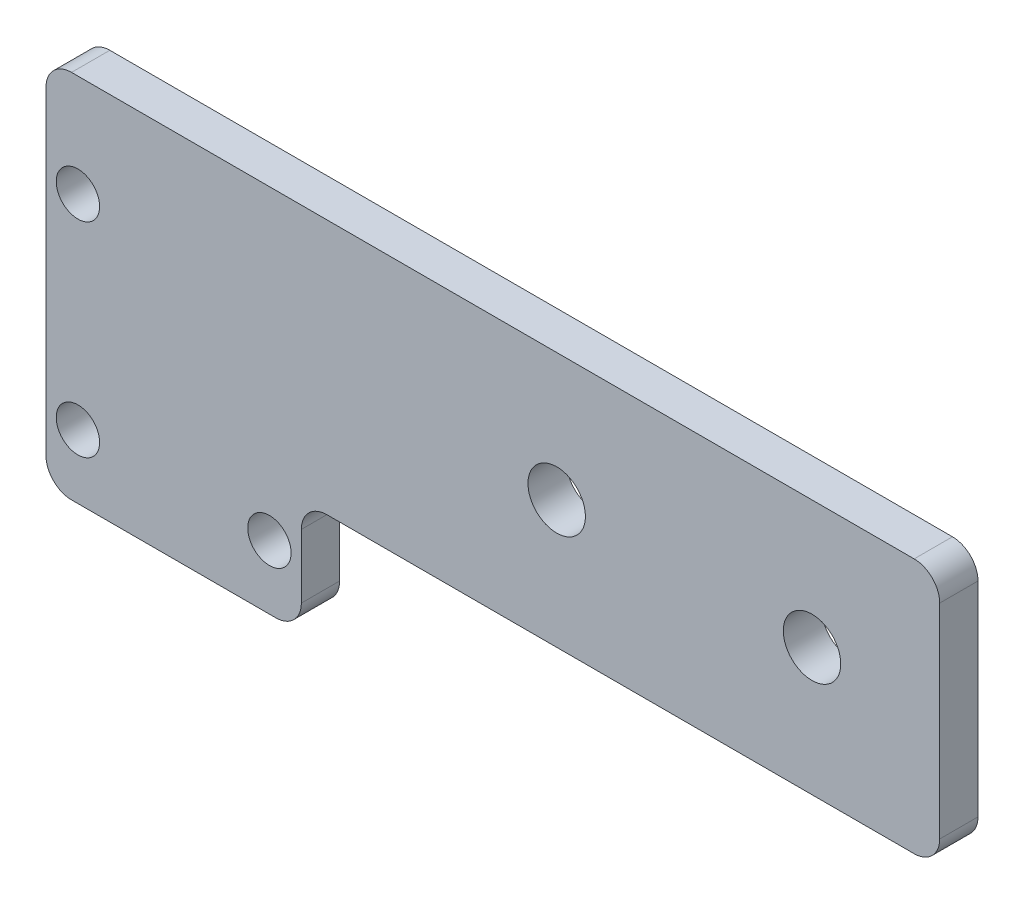
ISO-10303-21;
HEADER;
FILE_DESCRIPTION(('STEP AP214'),'2;1');
FILE_NAME('part.step','',(''),(''),'','','');
FILE_SCHEMA(('AUTOMOTIVE_DESIGN { 1 0 10303 214 1 1 1 1 }'));
ENDSEC;
DATA;
#1=APPLICATION_CONTEXT('core data for automotive mechanical design processes');
#2=APPLICATION_PROTOCOL_DEFINITION('international standard','automotive_design',2000,#1);
#3=PRODUCT_CONTEXT('',#1,'mechanical');
#4=PRODUCT('Part','Part','',(#3));
#5=PRODUCT_RELATED_PRODUCT_CATEGORY('part','',(#4));
#6=PRODUCT_DEFINITION_FORMATION('','',#4);
#7=PRODUCT_DEFINITION_CONTEXT('part definition',#1,'design');
#8=PRODUCT_DEFINITION('design','',#6,#7);
#9=PRODUCT_DEFINITION_SHAPE('','',#8);
#10=(LENGTH_UNIT() NAMED_UNIT(*) SI_UNIT(.MILLI.,.METRE.));
#11=(NAMED_UNIT(*) PLANE_ANGLE_UNIT() SI_UNIT($,.RADIAN.));
#12=(NAMED_UNIT(*) SI_UNIT($,.STERADIAN.) SOLID_ANGLE_UNIT());
#13=UNCERTAINTY_MEASURE_WITH_UNIT(LENGTH_MEASURE(1.E-05),#10,'distance_accuracy_value','');
#14=(GEOMETRIC_REPRESENTATION_CONTEXT(3) GLOBAL_UNCERTAINTY_ASSIGNED_CONTEXT((#13)) GLOBAL_UNIT_ASSIGNED_CONTEXT((#10,
#11,#12)) REPRESENTATION_CONTEXT('',''));
#15=CARTESIAN_POINT('',(0.,0.,0.));
#16=DIRECTION('',(0.,0.,1.));
#17=DIRECTION('',(1.,0.,0.));
#18=AXIS2_PLACEMENT_3D('',#15,#16,#17);
#19=CARTESIAN_POINT('',(50.,0.,3.));
#20=DIRECTION('',(0.,1.,0.));
#21=DIRECTION('',(-1.,0.,0.));
#22=AXIS2_PLACEMENT_3D('',#19,#20,#21);
#23=PLANE('',#22);
#24=DIRECTION('',(1.,0.,0.));
#25=VECTOR('',#24,1.);
#26=CARTESIAN_POINT('',(50.,0.,3.));
#27=LINE('',#26,#25);
#28=CARTESIAN_POINT('',(2.,0.,3.));
#29=VERTEX_POINT('',#28);
#30=CARTESIAN_POINT('',(48.,0.,3.));
#31=VERTEX_POINT('',#30);
#32=EDGE_CURVE('E167',#29,#31,#27,.T.);
#33=ORIENTED_EDGE('',*,*,#32,.F.);
#34=DIRECTION('',(0.,0.,-1.));
#35=VECTOR('',#34,1.);
#36=CARTESIAN_POINT('',(2.,0.,0.));
#37=LINE('',#36,#35);
#38=CARTESIAN_POINT('',(2.,0.,0.));
#39=VERTEX_POINT('',#38);
#40=EDGE_CURVE('E242',#29,#39,#37,.T.);
#41=ORIENTED_EDGE('',*,*,#40,.T.);
#42=DIRECTION('',(1.,0.,0.));
#43=VECTOR('',#42,1.);
#44=CARTESIAN_POINT('',(50.,0.,0.));
#45=LINE('',#44,#43);
#46=CARTESIAN_POINT('',(48.,0.,0.));
#47=VERTEX_POINT('',#46);
#48=EDGE_CURVE('E264',#39,#47,#45,.T.);
#49=ORIENTED_EDGE('',*,*,#48,.T.);
#50=DIRECTION('',(0.,0.,-1.));
#51=VECTOR('',#50,1.);
#52=CARTESIAN_POINT('',(48.,0.,3.));
#53=LINE('',#52,#51);
#54=EDGE_CURVE('E241',#47,#31,#53,.F.);
#55=ORIENTED_EDGE('',*,*,#54,.T.);
#56=EDGE_LOOP('',(#33,#41,#49,#55));
#57=FACE_BOUND('',#56,.T.);
#58=ADVANCED_FACE('F46',(#57),#23,.F.);
#59=CARTESIAN_POINT('',(50.,20.,3.));
#60=DIRECTION('',(-1.,0.,0.));
#61=DIRECTION('',(0.,0.,1.));
#62=AXIS2_PLACEMENT_3D('',#59,#60,#61);
#63=PLANE('',#62);
#64=DIRECTION('',(0.,1.,0.));
#65=VECTOR('',#64,1.);
#66=CARTESIAN_POINT('',(50.,20.,3.));
#67=LINE('',#66,#65);
#68=CARTESIAN_POINT('',(50.,2.,3.));
#69=VERTEX_POINT('',#68);
#70=CARTESIAN_POINT('',(50.,18.,3.));
#71=VERTEX_POINT('',#70);
#72=EDGE_CURVE('E215',#69,#71,#67,.T.);
#73=ORIENTED_EDGE('',*,*,#72,.F.);
#74=DIRECTION('',(0.,0.,-1.));
#75=VECTOR('',#74,1.);
#76=CARTESIAN_POINT('',(50.,2.,3.));
#77=LINE('',#76,#75);
#78=CARTESIAN_POINT('',(50.,2.,0.));
#79=VERTEX_POINT('',#78);
#80=EDGE_CURVE('E252',#69,#79,#77,.T.);
#81=ORIENTED_EDGE('',*,*,#80,.T.);
#82=DIRECTION('',(0.,1.,0.));
#83=VECTOR('',#82,1.);
#84=CARTESIAN_POINT('',(50.,20.,0.));
#85=LINE('',#84,#83);
#86=CARTESIAN_POINT('',(50.,18.,0.));
#87=VERTEX_POINT('',#86);
#88=EDGE_CURVE('E308',#79,#87,#85,.T.);
#89=ORIENTED_EDGE('',*,*,#88,.T.);
#90=DIRECTION('',(0.,0.,-1.));
#91=VECTOR('',#90,1.);
#92=CARTESIAN_POINT('',(50.,18.,3.));
#93=LINE('',#92,#91);
#94=EDGE_CURVE('E247',#87,#71,#93,.F.);
#95=ORIENTED_EDGE('',*,*,#94,.T.);
#96=EDGE_LOOP('',(#73,#81,#89,#95));
#97=FACE_BOUND('',#96,.T.);
#98=ADVANCED_FACE('F326',(#97),#63,.F.);
#99=CARTESIAN_POINT('',(-20.,20.,3.));
#100=DIRECTION('',(0.,-1.,0.));
#101=DIRECTION('',(0.,0.,-1.));
#102=AXIS2_PLACEMENT_3D('',#99,#100,#101);
#103=PLANE('',#102);
#104=DIRECTION('',(-1.,0.,0.));
#105=VECTOR('',#104,1.);
#106=CARTESIAN_POINT('',(-20.,20.,0.));
#107=LINE('',#106,#105);
#108=CARTESIAN_POINT('',(48.,20.,0.));
#109=VERTEX_POINT('',#108);
#110=CARTESIAN_POINT('',(-18.,20.,0.));
#111=VERTEX_POINT('',#110);
#112=EDGE_CURVE('E175',#109,#111,#107,.T.);
#113=ORIENTED_EDGE('',*,*,#112,.T.);
#114=DIRECTION('',(0.,0.,-1.));
#115=VECTOR('',#114,1.);
#116=CARTESIAN_POINT('',(-18.,20.,3.));
#117=LINE('',#116,#115);
#118=CARTESIAN_POINT('',(-18.,20.,3.));
#119=VERTEX_POINT('',#118);
#120=EDGE_CURVE('E259',#111,#119,#117,.F.);
#121=ORIENTED_EDGE('',*,*,#120,.T.);
#122=DIRECTION('',(-1.,0.,0.));
#123=VECTOR('',#122,1.);
#124=CARTESIAN_POINT('',(-20.,20.,3.));
#125=LINE('',#124,#123);
#126=CARTESIAN_POINT('',(48.,20.,3.));
#127=VERTEX_POINT('',#126);
#128=EDGE_CURVE('E207',#127,#119,#125,.T.);
#129=ORIENTED_EDGE('',*,*,#128,.F.);
#130=DIRECTION('',(0.,0.,-1.));
#131=VECTOR('',#130,1.);
#132=CARTESIAN_POINT('',(48.,20.,3.));
#133=LINE('',#132,#131);
#134=EDGE_CURVE('E253',#127,#109,#133,.T.);
#135=ORIENTED_EDGE('',*,*,#134,.T.);
#136=EDGE_LOOP('',(#113,#121,#129,#135));
#137=FACE_BOUND('',#136,.T.);
#138=ADVANCED_FACE('F304',(#137),#103,.F.);
#139=CARTESIAN_POINT('',(-20.,-9.,3.));
#140=DIRECTION('',(1.,0.,0.));
#141=DIRECTION('',(0.,0.,-1.));
#142=AXIS2_PLACEMENT_3D('',#139,#140,#141);
#143=PLANE('',#142);
#144=DIRECTION('',(0.,-1.,0.));
#145=VECTOR('',#144,1.);
#146=CARTESIAN_POINT('',(-20.,-9.,0.));
#147=LINE('',#146,#145);
#148=CARTESIAN_POINT('',(-20.,18.,0.));
#149=VERTEX_POINT('',#148);
#150=CARTESIAN_POINT('',(-20.,-7.,0.));
#151=VERTEX_POINT('',#150);
#152=EDGE_CURVE('E168',#149,#151,#147,.T.);
#153=ORIENTED_EDGE('',*,*,#152,.T.);
#154=DIRECTION('',(0.,0.,-1.));
#155=VECTOR('',#154,1.);
#156=CARTESIAN_POINT('',(-20.,-7.,3.));
#157=LINE('',#156,#155);
#158=CARTESIAN_POINT('',(-20.,-7.,3.));
#159=VERTEX_POINT('',#158);
#160=EDGE_CURVE('E142',#151,#159,#157,.F.);
#161=ORIENTED_EDGE('',*,*,#160,.T.);
#162=DIRECTION('',(0.,-1.,0.));
#163=VECTOR('',#162,1.);
#164=CARTESIAN_POINT('',(-20.,-9.,3.));
#165=LINE('',#164,#163);
#166=CARTESIAN_POINT('',(-20.,18.,3.));
#167=VERTEX_POINT('',#166);
#168=EDGE_CURVE('E213',#167,#159,#165,.T.);
#169=ORIENTED_EDGE('',*,*,#168,.F.);
#170=DIRECTION('',(0.,0.,-1.));
#171=VECTOR('',#170,1.);
#172=CARTESIAN_POINT('',(-20.,18.,3.));
#173=LINE('',#172,#171);
#174=EDGE_CURVE('E150',#167,#149,#173,.T.);
#175=ORIENTED_EDGE('',*,*,#174,.T.);
#176=EDGE_LOOP('',(#153,#161,#169,#175));
#177=FACE_BOUND('',#176,.T.);
#178=ADVANCED_FACE('F297',(#177),#143,.F.);
#179=CARTESIAN_POINT('',(0.,-9.,3.));
#180=DIRECTION('',(0.,1.,0.));
#181=DIRECTION('',(0.,0.,1.));
#182=AXIS2_PLACEMENT_3D('',#179,#180,#181);
#183=PLANE('',#182);
#184=DIRECTION('',(0.,0.,-1.));
#185=VECTOR('',#184,1.);
#186=CARTESIAN_POINT('',(-2.,-9.,3.));
#187=LINE('',#186,#185);
#188=CARTESIAN_POINT('',(-2.,-9.,0.));
#189=VERTEX_POINT('',#188);
#190=CARTESIAN_POINT('',(-2.,-9.,3.));
#191=VERTEX_POINT('',#190);
#192=EDGE_CURVE('E233',#189,#191,#187,.F.);
#193=ORIENTED_EDGE('',*,*,#192,.T.);
#194=DIRECTION('',(1.,0.,0.));
#195=VECTOR('',#194,1.);
#196=CARTESIAN_POINT('',(-15.,-9.,3.));
#197=LINE('',#196,#195);
#198=CARTESIAN_POINT('',(-18.,-9.,3.));
#199=VERTEX_POINT('',#198);
#200=EDGE_CURVE('E159',#199,#191,#197,.T.);
#201=ORIENTED_EDGE('',*,*,#200,.F.);
#202=DIRECTION('',(0.,0.,-1.));
#203=VECTOR('',#202,1.);
#204=CARTESIAN_POINT('',(-18.,-9.,3.));
#205=LINE('',#204,#203);
#206=CARTESIAN_POINT('',(-18.,-9.,0.));
#207=VERTEX_POINT('',#206);
#208=EDGE_CURVE('E137',#199,#207,#205,.T.);
#209=ORIENTED_EDGE('',*,*,#208,.T.);
#210=DIRECTION('',(1.,0.,0.));
#211=VECTOR('',#210,1.);
#212=CARTESIAN_POINT('',(-15.,-9.,0.));
#213=LINE('',#212,#211);
#214=EDGE_CURVE('E154',#207,#189,#213,.T.);
#215=ORIENTED_EDGE('',*,*,#214,.T.);
#216=EDGE_LOOP('',(#193,#201,#209,#215));
#217=FACE_BOUND('',#216,.T.);
#218=ADVANCED_FACE('F153',(#217),#183,.F.);
#219=CARTESIAN_POINT('',(0.,0.,3.));
#220=DIRECTION('',(-1.,0.,0.));
#221=DIRECTION('',(0.,-1.,0.));
#222=AXIS2_PLACEMENT_3D('',#219,#220,#221);
#223=PLANE('',#222);
#224=DIRECTION('',(0.,1.,0.));
#225=VECTOR('',#224,1.);
#226=CARTESIAN_POINT('',(0.,0.,3.));
#227=LINE('',#226,#225);
#228=CARTESIAN_POINT('',(0.,-7.,3.));
#229=VERTEX_POINT('',#228);
#230=CARTESIAN_POINT('',(0.,-2.,3.));
#231=VERTEX_POINT('',#230);
#232=EDGE_CURVE('E158',#229,#231,#227,.T.);
#233=ORIENTED_EDGE('',*,*,#232,.F.);
#234=DIRECTION('',(0.,0.,-1.));
#235=VECTOR('',#234,1.);
#236=CARTESIAN_POINT('',(0.,-7.,3.));
#237=LINE('',#236,#235);
#238=CARTESIAN_POINT('',(0.,-7.,0.));
#239=VERTEX_POINT('',#238);
#240=EDGE_CURVE('E240',#229,#239,#237,.T.);
#241=ORIENTED_EDGE('',*,*,#240,.T.);
#242=DIRECTION('',(0.,1.,0.));
#243=VECTOR('',#242,1.);
#244=CARTESIAN_POINT('',(0.,0.,0.));
#245=LINE('',#244,#243);
#246=CARTESIAN_POINT('',(0.,-2.,0.));
#247=VERTEX_POINT('',#246);
#248=EDGE_CURVE('E164',#239,#247,#245,.T.);
#249=ORIENTED_EDGE('',*,*,#248,.T.);
#250=DIRECTION('',(0.,0.,-1.));
#251=VECTOR('',#250,1.);
#252=CARTESIAN_POINT('',(0.,-2.,3.));
#253=LINE('',#252,#251);
#254=EDGE_CURVE('E65',#247,#231,#253,.F.);
#255=ORIENTED_EDGE('',*,*,#254,.T.);
#256=EDGE_LOOP('',(#233,#241,#249,#255));
#257=FACE_BOUND('',#256,.T.);
#258=ADVANCED_FACE('F266',(#257),#223,.F.);
#259=CARTESIAN_POINT('',(-10.,-21.,3.));
#260=DIRECTION('',(0.,0.,1.));
#261=DIRECTION('',(1.,0.,0.));
#262=AXIS2_PLACEMENT_3D('',#259,#260,#261);
#263=PLANE('',#262);
#264=ORIENTED_EDGE('',*,*,#200,.T.);
#265=CARTESIAN_POINT('',(-2.,-7.,3.));
#266=DIRECTION('',(0.,0.,1.));
#267=DIRECTION('',(1.,0.,0.));
#268=AXIS2_PLACEMENT_3D('',#265,#266,#267);
#269=CIRCLE('',#268,2.);
#270=EDGE_CURVE('E69',#191,#229,#269,.T.);
#271=ORIENTED_EDGE('',*,*,#270,.T.);
#272=ORIENTED_EDGE('',*,*,#232,.T.);
#273=CARTESIAN_POINT('',(2.,-2.,3.));
#274=DIRECTION('',(0.,0.,1.));
#275=DIRECTION('',(1.,0.,0.));
#276=AXIS2_PLACEMENT_3D('',#273,#274,#275);
#277=CIRCLE('',#276,2.);
#278=EDGE_CURVE('E12',#231,#29,#277,.F.);
#279=ORIENTED_EDGE('',*,*,#278,.T.);
#280=ORIENTED_EDGE('',*,*,#32,.T.);
#281=CARTESIAN_POINT('',(48.,2.,3.));
#282=DIRECTION('',(0.,0.,1.));
#283=DIRECTION('',(1.,0.,0.));
#284=AXIS2_PLACEMENT_3D('',#281,#282,#283);
#285=CIRCLE('',#284,2.);
#286=EDGE_CURVE('E286',#31,#69,#285,.T.);
#287=ORIENTED_EDGE('',*,*,#286,.T.);
#288=ORIENTED_EDGE('',*,*,#72,.T.);
#289=CARTESIAN_POINT('',(48.,18.,3.));
#290=DIRECTION('',(0.,0.,1.));
#291=DIRECTION('',(1.,0.,0.));
#292=AXIS2_PLACEMENT_3D('',#289,#290,#291);
#293=CIRCLE('',#292,2.);
#294=EDGE_CURVE('E193',#71,#127,#293,.T.);
#295=ORIENTED_EDGE('',*,*,#294,.T.);
#296=ORIENTED_EDGE('',*,*,#128,.T.);
#297=CARTESIAN_POINT('',(-18.,18.,3.));
#298=DIRECTION('',(0.,0.,1.));
#299=DIRECTION('',(1.,0.,0.));
#300=AXIS2_PLACEMENT_3D('',#297,#298,#299);
#301=CIRCLE('',#300,2.);
#302=EDGE_CURVE('E192',#119,#167,#301,.T.);
#303=ORIENTED_EDGE('',*,*,#302,.T.);
#304=ORIENTED_EDGE('',*,*,#168,.T.);
#305=CARTESIAN_POINT('',(-18.,-7.,3.));
#306=DIRECTION('',(0.,0.,1.));
#307=DIRECTION('',(1.,0.,0.));
#308=AXIS2_PLACEMENT_3D('',#305,#306,#307);
#309=CIRCLE('',#308,2.);
#310=EDGE_CURVE('E228',#159,#199,#309,.T.);
#311=ORIENTED_EDGE('',*,*,#310,.T.);
#312=EDGE_LOOP('',(#264,#271,#272,#279,#280,#287,#288,#295,#296,#303,#304,#311));
#313=FACE_BOUND('',#312,.T.);
#314=CARTESIAN_POINT('',(-17.5,12.,3.));
#315=DIRECTION('',(0.,0.,1.));
#316=DIRECTION('',(1.,0.,0.));
#317=AXIS2_PLACEMENT_3D('',#314,#315,#316);
#318=CIRCLE('',#317,1.7);
#319=CARTESIAN_POINT('',(-15.8,12.,3.));
#320=VERTEX_POINT('',#319);
#321=EDGE_CURVE('E380',#320,#320,#318,.T.);
#322=ORIENTED_EDGE('',*,*,#321,.F.);
#323=EDGE_LOOP('',(#322));
#324=FACE_BOUND('',#323,.T.);
#325=CARTESIAN_POINT('',(-2.5,-4.,3.));
#326=DIRECTION('',(0.,0.,1.));
#327=DIRECTION('',(1.,0.,0.));
#328=AXIS2_PLACEMENT_3D('',#325,#326,#327);
#329=CIRCLE('',#328,1.7);
#330=CARTESIAN_POINT('',(-0.800000000000001,-4.,3.));
#331=VERTEX_POINT('',#330);
#332=EDGE_CURVE('E379',#331,#331,#329,.T.);
#333=ORIENTED_EDGE('',*,*,#332,.F.);
#334=EDGE_LOOP('',(#333));
#335=FACE_BOUND('',#334,.T.);
#336=CARTESIAN_POINT('',(-17.5,-4.,3.));
#337=DIRECTION('',(0.,0.,1.));
#338=DIRECTION('',(1.,0.,0.));
#339=AXIS2_PLACEMENT_3D('',#336,#337,#338);
#340=CIRCLE('',#339,1.7);
#341=CARTESIAN_POINT('',(-15.8,-4.,3.));
#342=VERTEX_POINT('',#341);
#343=EDGE_CURVE('E395',#342,#342,#340,.T.);
#344=ORIENTED_EDGE('',*,*,#343,.F.);
#345=EDGE_LOOP('',(#344));
#346=FACE_BOUND('',#345,.T.);
#347=CARTESIAN_POINT('',(40.,10.,3.));
#348=DIRECTION('',(0.,0.,1.));
#349=DIRECTION('',(1.,0.,0.));
#350=AXIS2_PLACEMENT_3D('',#347,#348,#349);
#351=CIRCLE('',#350,2.25);
#352=CARTESIAN_POINT('',(42.25,10.,3.));
#353=VERTEX_POINT('',#352);
#354=EDGE_CURVE('E397',#353,#353,#351,.T.);
#355=ORIENTED_EDGE('',*,*,#354,.F.);
#356=EDGE_LOOP('',(#355));
#357=FACE_BOUND('',#356,.T.);
#358=CARTESIAN_POINT('',(20.,10.,3.));
#359=DIRECTION('',(0.,0.,1.));
#360=DIRECTION('',(1.,0.,0.));
#361=AXIS2_PLACEMENT_3D('',#358,#359,#360);
#362=CIRCLE('',#361,2.25);
#363=CARTESIAN_POINT('',(22.25,10.,3.));
#364=VERTEX_POINT('',#363);
#365=EDGE_CURVE('E406',#364,#364,#362,.T.);
#366=ORIENTED_EDGE('',*,*,#365,.F.);
#367=EDGE_LOOP('',(#366));
#368=FACE_BOUND('',#367,.T.);
#369=ADVANCED_FACE('F271',(#313,#324,#335,#346,#357,#368),#263,.T.);
#370=CARTESIAN_POINT('',(-10.,-21.,0.));
#371=DIRECTION('',(0.,0.,1.));
#372=DIRECTION('',(1.,0.,0.));
#373=AXIS2_PLACEMENT_3D('',#370,#371,#372);
#374=PLANE('',#373);
#375=CARTESIAN_POINT('',(-17.5,12.,0.));
#376=DIRECTION('',(0.,0.,1.));
#377=DIRECTION('',(1.,0.,0.));
#378=AXIS2_PLACEMENT_3D('',#375,#376,#377);
#379=CIRCLE('',#378,1.7);
#380=CARTESIAN_POINT('',(-15.8,12.,0.));
#381=VERTEX_POINT('',#380);
#382=EDGE_CURVE('E372',#381,#381,#379,.T.);
#383=ORIENTED_EDGE('',*,*,#382,.T.);
#384=EDGE_LOOP('',(#383));
#385=FACE_BOUND('',#384,.T.);
#386=CARTESIAN_POINT('',(-2.5,-4.,0.));
#387=DIRECTION('',(0.,0.,1.));
#388=DIRECTION('',(1.,0.,0.));
#389=AXIS2_PLACEMENT_3D('',#386,#387,#388);
#390=CIRCLE('',#389,1.7);
#391=CARTESIAN_POINT('',(-0.800000000000002,-4.,0.));
#392=VERTEX_POINT('',#391);
#393=EDGE_CURVE('E386',#392,#392,#390,.T.);
#394=ORIENTED_EDGE('',*,*,#393,.T.);
#395=EDGE_LOOP('',(#394));
#396=FACE_BOUND('',#395,.T.);
#397=CARTESIAN_POINT('',(-17.5,-4.,0.));
#398=DIRECTION('',(0.,0.,1.));
#399=DIRECTION('',(1.,0.,0.));
#400=AXIS2_PLACEMENT_3D('',#397,#398,#399);
#401=CIRCLE('',#400,1.7);
#402=CARTESIAN_POINT('',(-15.8,-4.,0.));
#403=VERTEX_POINT('',#402);
#404=EDGE_CURVE('E396',#403,#403,#401,.T.);
#405=ORIENTED_EDGE('',*,*,#404,.T.);
#406=EDGE_LOOP('',(#405));
#407=FACE_BOUND('',#406,.T.);
#408=CARTESIAN_POINT('',(40.,10.,0.));
#409=DIRECTION('',(0.,0.,1.));
#410=DIRECTION('',(1.,0.,0.));
#411=AXIS2_PLACEMENT_3D('',#408,#409,#410);
#412=CIRCLE('',#411,2.25);
#413=CARTESIAN_POINT('',(42.25,10.,0.));
#414=VERTEX_POINT('',#413);
#415=EDGE_CURVE('E403',#414,#414,#412,.T.);
#416=ORIENTED_EDGE('',*,*,#415,.T.);
#417=EDGE_LOOP('',(#416));
#418=FACE_BOUND('',#417,.T.);
#419=CARTESIAN_POINT('',(20.,10.,0.));
#420=DIRECTION('',(0.,0.,1.));
#421=DIRECTION('',(1.,0.,0.));
#422=AXIS2_PLACEMENT_3D('',#419,#420,#421);
#423=CIRCLE('',#422,2.25);
#424=CARTESIAN_POINT('',(22.25,10.,0.));
#425=VERTEX_POINT('',#424);
#426=EDGE_CURVE('E283',#425,#425,#423,.T.);
#427=ORIENTED_EDGE('',*,*,#426,.T.);
#428=EDGE_LOOP('',(#427));
#429=FACE_BOUND('',#428,.T.);
#430=CARTESIAN_POINT('',(-2.,-7.,0.));
#431=DIRECTION('',(0.,0.,1.));
#432=DIRECTION('',(1.,0.,0.));
#433=AXIS2_PLACEMENT_3D('',#430,#431,#432);
#434=CIRCLE('',#433,2.);
#435=EDGE_CURVE('E146',#239,#189,#434,.F.);
#436=ORIENTED_EDGE('',*,*,#435,.T.);
#437=ORIENTED_EDGE('',*,*,#214,.F.);
#438=CARTESIAN_POINT('',(-18.,-7.,0.));
#439=DIRECTION('',(0.,0.,1.));
#440=DIRECTION('',(1.,0.,0.));
#441=AXIS2_PLACEMENT_3D('',#438,#439,#440);
#442=CIRCLE('',#441,2.);
#443=EDGE_CURVE('E139',#207,#151,#442,.F.);
#444=ORIENTED_EDGE('',*,*,#443,.T.);
#445=ORIENTED_EDGE('',*,*,#152,.F.);
#446=CARTESIAN_POINT('',(-18.,18.,0.));
#447=DIRECTION('',(0.,0.,1.));
#448=DIRECTION('',(1.,0.,0.));
#449=AXIS2_PLACEMENT_3D('',#446,#447,#448);
#450=CIRCLE('',#449,2.);
#451=EDGE_CURVE('E178',#149,#111,#450,.F.);
#452=ORIENTED_EDGE('',*,*,#451,.T.);
#453=ORIENTED_EDGE('',*,*,#112,.F.);
#454=CARTESIAN_POINT('',(48.,18.,0.));
#455=DIRECTION('',(0.,0.,1.));
#456=DIRECTION('',(1.,0.,0.));
#457=AXIS2_PLACEMENT_3D('',#454,#455,#456);
#458=CIRCLE('',#457,2.);
#459=EDGE_CURVE('E160',#109,#87,#458,.F.);
#460=ORIENTED_EDGE('',*,*,#459,.T.);
#461=ORIENTED_EDGE('',*,*,#88,.F.);
#462=CARTESIAN_POINT('',(48.,2.,0.));
#463=DIRECTION('',(0.,0.,1.));
#464=DIRECTION('',(1.,0.,0.));
#465=AXIS2_PLACEMENT_3D('',#462,#463,#464);
#466=CIRCLE('',#465,2.);
#467=EDGE_CURVE('E181',#79,#47,#466,.F.);
#468=ORIENTED_EDGE('',*,*,#467,.T.);
#469=ORIENTED_EDGE('',*,*,#48,.F.);
#470=CARTESIAN_POINT('',(2.,-2.,0.));
#471=DIRECTION('',(0.,0.,1.));
#472=DIRECTION('',(1.,0.,0.));
#473=AXIS2_PLACEMENT_3D('',#470,#471,#472);
#474=CIRCLE('',#473,2.);
#475=EDGE_CURVE('E54',#39,#247,#474,.T.);
#476=ORIENTED_EDGE('',*,*,#475,.T.);
#477=ORIENTED_EDGE('',*,*,#248,.F.);
#478=EDGE_LOOP('',(#436,#437,#444,#445,#452,#453,#460,#461,#468,#469,#476,#477));
#479=FACE_BOUND('',#478,.T.);
#480=ADVANCED_FACE('F163',(#385,#396,#407,#418,#429,#479),#374,.F.);
#481=CARTESIAN_POINT('',(20.,10.,3.));
#482=DIRECTION('',(0.,0.,1.));
#483=DIRECTION('',(1.,0.,0.));
#484=AXIS2_PLACEMENT_3D('',#481,#482,#483);
#485=CYLINDRICAL_SURFACE('',#484,2.25);
#486=ORIENTED_EDGE('',*,*,#426,.F.);
#487=EDGE_LOOP('',(#486));
#488=FACE_BOUND('',#487,.T.);
#489=ORIENTED_EDGE('',*,*,#365,.T.);
#490=EDGE_LOOP('',(#489));
#491=FACE_BOUND('',#490,.T.);
#492=ADVANCED_FACE('F349',(#488,#491),#485,.F.);
#493=CARTESIAN_POINT('',(40.,10.,3.));
#494=DIRECTION('',(0.,0.,1.));
#495=DIRECTION('',(1.,0.,0.));
#496=AXIS2_PLACEMENT_3D('',#493,#494,#495);
#497=CYLINDRICAL_SURFACE('',#496,2.25);
#498=ORIENTED_EDGE('',*,*,#415,.F.);
#499=EDGE_LOOP('',(#498));
#500=FACE_BOUND('',#499,.T.);
#501=ORIENTED_EDGE('',*,*,#354,.T.);
#502=EDGE_LOOP('',(#501));
#503=FACE_BOUND('',#502,.T.);
#504=ADVANCED_FACE('F352',(#500,#503),#497,.F.);
#505=CARTESIAN_POINT('',(-17.5,-4.,3.));
#506=DIRECTION('',(0.,0.,1.));
#507=DIRECTION('',(1.,0.,0.));
#508=AXIS2_PLACEMENT_3D('',#505,#506,#507);
#509=CYLINDRICAL_SURFACE('',#508,1.7);
#510=ORIENTED_EDGE('',*,*,#404,.F.);
#511=EDGE_LOOP('',(#510));
#512=FACE_BOUND('',#511,.T.);
#513=ORIENTED_EDGE('',*,*,#343,.T.);
#514=EDGE_LOOP('',(#513));
#515=FACE_BOUND('',#514,.T.);
#516=ADVANCED_FACE('F360',(#512,#515),#509,.F.);
#517=CARTESIAN_POINT('',(-2.5,-4.,3.));
#518=DIRECTION('',(0.,0.,1.));
#519=DIRECTION('',(1.,0.,0.));
#520=AXIS2_PLACEMENT_3D('',#517,#518,#519);
#521=CYLINDRICAL_SURFACE('',#520,1.7);
#522=ORIENTED_EDGE('',*,*,#393,.F.);
#523=EDGE_LOOP('',(#522));
#524=FACE_BOUND('',#523,.T.);
#525=ORIENTED_EDGE('',*,*,#332,.T.);
#526=EDGE_LOOP('',(#525));
#527=FACE_BOUND('',#526,.T.);
#528=ADVANCED_FACE('F361',(#524,#527),#521,.F.);
#529=CARTESIAN_POINT('',(-17.5,12.,3.));
#530=DIRECTION('',(0.,0.,1.));
#531=DIRECTION('',(1.,0.,0.));
#532=AXIS2_PLACEMENT_3D('',#529,#530,#531);
#533=CYLINDRICAL_SURFACE('',#532,1.7);
#534=ORIENTED_EDGE('',*,*,#382,.F.);
#535=EDGE_LOOP('',(#534));
#536=FACE_BOUND('',#535,.T.);
#537=ORIENTED_EDGE('',*,*,#321,.T.);
#538=EDGE_LOOP('',(#537));
#539=FACE_BOUND('',#538,.T.);
#540=ADVANCED_FACE('F330',(#536,#539),#533,.F.);
#541=CARTESIAN_POINT('',(-18.,-7.,3.));
#542=DIRECTION('',(0.,0.,-1.));
#543=DIRECTION('',(-1.,0.,0.));
#544=AXIS2_PLACEMENT_3D('',#541,#542,#543);
#545=CYLINDRICAL_SURFACE('',#544,2.);
#546=ORIENTED_EDGE('',*,*,#310,.F.);
#547=ORIENTED_EDGE('',*,*,#160,.F.);
#548=ORIENTED_EDGE('',*,*,#443,.F.);
#549=ORIENTED_EDGE('',*,*,#208,.F.);
#550=EDGE_LOOP('',(#546,#547,#548,#549));
#551=FACE_BOUND('',#550,.T.);
#552=ADVANCED_FACE('F138',(#551),#545,.T.);
#553=CARTESIAN_POINT('',(-2.,-7.,3.));
#554=DIRECTION('',(0.,0.,-1.));
#555=DIRECTION('',(-1.,0.,0.));
#556=AXIS2_PLACEMENT_3D('',#553,#554,#555);
#557=CYLINDRICAL_SURFACE('',#556,2.);
#558=ORIENTED_EDGE('',*,*,#270,.F.);
#559=ORIENTED_EDGE('',*,*,#192,.F.);
#560=ORIENTED_EDGE('',*,*,#435,.F.);
#561=ORIENTED_EDGE('',*,*,#240,.F.);
#562=EDGE_LOOP('',(#558,#559,#560,#561));
#563=FACE_BOUND('',#562,.T.);
#564=ADVANCED_FACE('F319',(#563),#557,.T.);
#565=CARTESIAN_POINT('',(2.,-2.,3.));
#566=DIRECTION('',(0.,0.,1.));
#567=DIRECTION('',(1.,0.,0.));
#568=AXIS2_PLACEMENT_3D('',#565,#566,#567);
#569=CYLINDRICAL_SURFACE('',#568,2.);
#570=ORIENTED_EDGE('',*,*,#278,.F.);
#571=ORIENTED_EDGE('',*,*,#254,.F.);
#572=ORIENTED_EDGE('',*,*,#475,.F.);
#573=ORIENTED_EDGE('',*,*,#40,.F.);
#574=EDGE_LOOP('',(#570,#571,#572,#573));
#575=FACE_BOUND('',#574,.T.);
#576=ADVANCED_FACE('F267',(#575),#569,.F.);
#577=CARTESIAN_POINT('',(48.,2.,3.));
#578=DIRECTION('',(0.,0.,-1.));
#579=DIRECTION('',(-1.,0.,0.));
#580=AXIS2_PLACEMENT_3D('',#577,#578,#579);
#581=CYLINDRICAL_SURFACE('',#580,2.);
#582=ORIENTED_EDGE('',*,*,#286,.F.);
#583=ORIENTED_EDGE('',*,*,#54,.F.);
#584=ORIENTED_EDGE('',*,*,#467,.F.);
#585=ORIENTED_EDGE('',*,*,#80,.F.);
#586=EDGE_LOOP('',(#582,#583,#584,#585));
#587=FACE_BOUND('',#586,.T.);
#588=ADVANCED_FACE('F322',(#587),#581,.T.);
#589=CARTESIAN_POINT('',(-18.,18.,3.));
#590=DIRECTION('',(0.,0.,-1.));
#591=DIRECTION('',(-1.,0.,0.));
#592=AXIS2_PLACEMENT_3D('',#589,#590,#591);
#593=CYLINDRICAL_SURFACE('',#592,2.);
#594=ORIENTED_EDGE('',*,*,#302,.F.);
#595=ORIENTED_EDGE('',*,*,#120,.F.);
#596=ORIENTED_EDGE('',*,*,#451,.F.);
#597=ORIENTED_EDGE('',*,*,#174,.F.);
#598=EDGE_LOOP('',(#594,#595,#596,#597));
#599=FACE_BOUND('',#598,.T.);
#600=ADVANCED_FACE('F301',(#599),#593,.T.);
#601=CARTESIAN_POINT('',(48.,18.,3.));
#602=DIRECTION('',(0.,0.,-1.));
#603=DIRECTION('',(-1.,0.,0.));
#604=AXIS2_PLACEMENT_3D('',#601,#602,#603);
#605=CYLINDRICAL_SURFACE('',#604,2.);
#606=ORIENTED_EDGE('',*,*,#294,.F.);
#607=ORIENTED_EDGE('',*,*,#94,.F.);
#608=ORIENTED_EDGE('',*,*,#459,.F.);
#609=ORIENTED_EDGE('',*,*,#134,.F.);
#610=EDGE_LOOP('',(#606,#607,#608,#609));
#611=FACE_BOUND('',#610,.T.);
#612=ADVANCED_FACE('F48',(#611),#605,.T.);
#613=CLOSED_SHELL('',(#58,#98,#138,#178,#218,#258,#369,#480,#492,#504,#516,#528,#540,#552,#564,
#576,#588,#600,#612));
#614=MANIFOLD_SOLID_BREP('B2',#613);
#615=ADVANCED_BREP_SHAPE_REPRESENTATION('',(#18,#614),#14);
#616=SHAPE_DEFINITION_REPRESENTATION(#9,#615);
ENDSEC;
END-ISO-10303-21;
